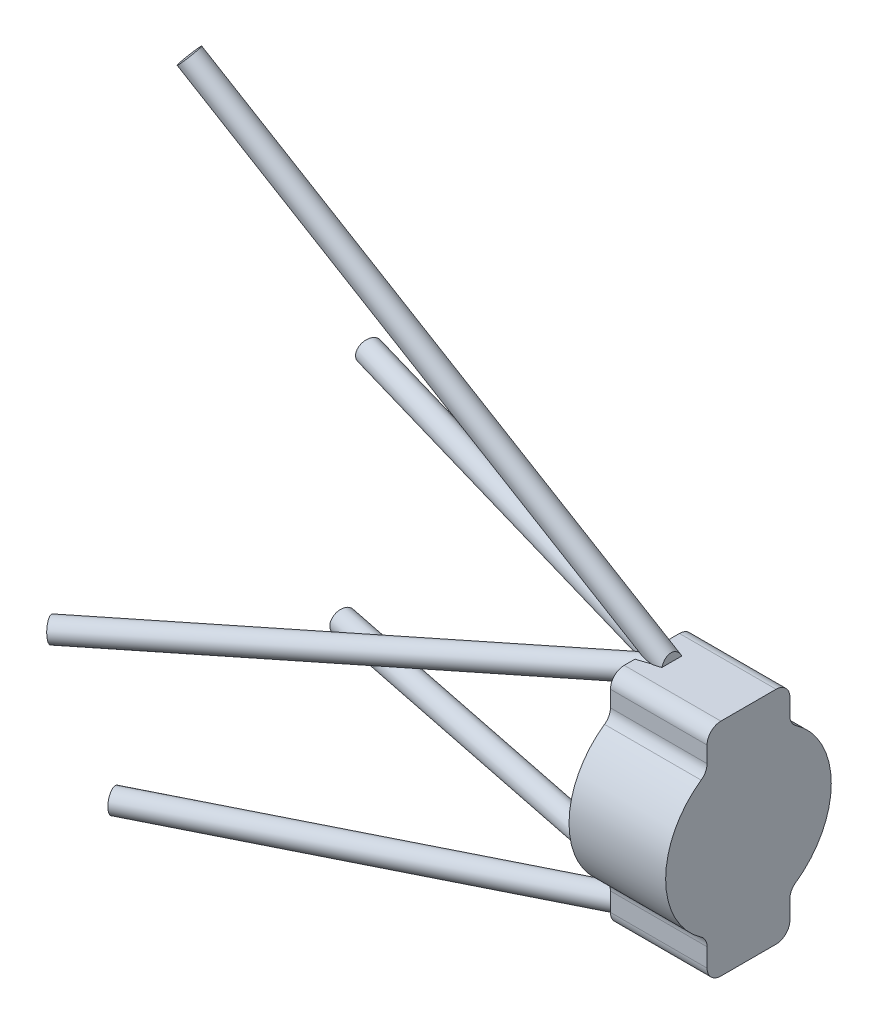
ISO-10303-21;
HEADER;
FILE_DESCRIPTION(('STEP AP214'),'2;1');
FILE_NAME('part.step','',(''),(''),'','','');
FILE_SCHEMA(('AUTOMOTIVE_DESIGN { 1 0 10303 214 1 1 1 1 }'));
ENDSEC;
DATA;
#1=APPLICATION_CONTEXT('core data for automotive mechanical design processes');
#2=APPLICATION_PROTOCOL_DEFINITION('international standard','automotive_design',2000,#1);
#3=PRODUCT_CONTEXT('',#1,'mechanical');
#4=PRODUCT('Part','Part','',(#3));
#5=PRODUCT_RELATED_PRODUCT_CATEGORY('part','',(#4));
#6=PRODUCT_DEFINITION_FORMATION('','',#4);
#7=PRODUCT_DEFINITION_CONTEXT('part definition',#1,'design');
#8=PRODUCT_DEFINITION('design','',#6,#7);
#9=PRODUCT_DEFINITION_SHAPE('','',#8);
#10=(LENGTH_UNIT() NAMED_UNIT(*) SI_UNIT(.MILLI.,.METRE.));
#11=(NAMED_UNIT(*) PLANE_ANGLE_UNIT() SI_UNIT($,.RADIAN.));
#12=(NAMED_UNIT(*) SI_UNIT($,.STERADIAN.) SOLID_ANGLE_UNIT());
#13=UNCERTAINTY_MEASURE_WITH_UNIT(LENGTH_MEASURE(1.E-05),#10,'distance_accuracy_value','');
#14=(GEOMETRIC_REPRESENTATION_CONTEXT(3) GLOBAL_UNCERTAINTY_ASSIGNED_CONTEXT((#13)) GLOBAL_UNIT_ASSIGNED_CONTEXT((#10,
#11,#12)) REPRESENTATION_CONTEXT('',''));
#15=CARTESIAN_POINT('',(0.,0.,0.));
#16=DIRECTION('',(0.,0.,1.));
#17=DIRECTION('',(1.,0.,0.));
#18=AXIS2_PLACEMENT_3D('',#15,#16,#17);
#19=CARTESIAN_POINT('',(535.,121.,0.));
#20=DIRECTION('',(0.,1.,0.));
#21=DIRECTION('',(0.,0.,-1.));
#22=AXIS2_PLACEMENT_3D('',#19,#20,#21);
#23=PLANE('',#22);
#24=CARTESIAN_POINT('',(625.,121.,615.470743605705));
#25=DIRECTION('',(0.,-1.,0.));
#26=DIRECTION('',(-0.984919836826868,0.,-0.173011314730962));
#27=AXIS2_PLACEMENT_3D('',#24,#25,#26);
#28=ELLIPSE('',#27,235.687976944856,8.00000000000003);
#29=CARTESIAN_POINT('',(480.,121.,583.687334384309));
#30=VERTEX_POINT('',#29);
#31=CARTESIAN_POINT('',(465.,121.,581.513610561944));
#32=VERTEX_POINT('',#31);
#33=EDGE_CURVE('E198',#30,#32,#28,.F.);
#34=ORIENTED_EDGE('',*,*,#33,.T.);
#35=DIRECTION('',(0.,0.,1.));
#36=VECTOR('',#35,1.);
#37=CARTESIAN_POINT('',(465.,121.,0.));
#38=LINE('',#37,#36);
#39=CARTESIAN_POINT('',(465.,121.,570.));
#40=VERTEX_POINT('',#39);
#41=EDGE_CURVE('E249',#40,#32,#38,.T.);
#42=ORIENTED_EDGE('',*,*,#41,.F.);
#43=DIRECTION('',(-1.,0.,0.));
#44=VECTOR('',#43,1.);
#45=CARTESIAN_POINT('',(535.,121.,570.));
#46=LINE('',#45,#44);
#47=CARTESIAN_POINT('',(535.,121.,570.));
#48=VERTEX_POINT('',#47);
#49=EDGE_CURVE('E295',#48,#40,#46,.T.);
#50=ORIENTED_EDGE('',*,*,#49,.F.);
#51=DIRECTION('',(0.,0.,1.));
#52=VECTOR('',#51,1.);
#53=CARTESIAN_POINT('',(535.,121.,0.));
#54=LINE('',#53,#52);
#55=CARTESIAN_POINT('',(535.,121.,610.));
#56=VERTEX_POINT('',#55);
#57=EDGE_CURVE('E226',#48,#56,#54,.T.);
#58=ORIENTED_EDGE('',*,*,#57,.T.);
#59=DIRECTION('',(-1.,0.,0.));
#60=VECTOR('',#59,1.);
#61=CARTESIAN_POINT('',(535.,121.,610.));
#62=LINE('',#61,#60);
#63=CARTESIAN_POINT('',(465.,121.,610.));
#64=VERTEX_POINT('',#63);
#65=EDGE_CURVE('E292',#64,#56,#62,.F.);
#66=ORIENTED_EDGE('',*,*,#65,.F.);
#67=CARTESIAN_POINT('',(465.,121.,603.506205639318));
#68=VERTEX_POINT('',#67);
#69=EDGE_CURVE('E248',#68,#64,#38,.T.);
#70=ORIENTED_EDGE('',*,*,#69,.F.);
#71=CARTESIAN_POINT('',(407.5,121.,618.637222806044));
#72=DIRECTION('',(0.,-1.,0.));
#73=DIRECTION('',(0.930072822847603,0.,-0.367375209017009));
#74=AXIS2_PLACEMENT_3D('',#71,#72,#73);
#75=ELLIPSE('',#74,124.977725042946,8.00000000000003);
#76=CARTESIAN_POINT('',(480.,121.,596.858117852031));
#77=VERTEX_POINT('',#76);
#78=EDGE_CURVE('E203',#68,#77,#75,.F.);
#79=ORIENTED_EDGE('',*,*,#78,.T.);
#80=DIRECTION('',(0.,0.,1.));
#81=VECTOR('',#80,1.);
#82=CARTESIAN_POINT('',(480.,121.,0.));
#83=LINE('',#82,#81);
#84=EDGE_CURVE('E11',#30,#77,#83,.T.);
#85=ORIENTED_EDGE('',*,*,#84,.F.);
#86=EDGE_LOOP('',(#34,#42,#50,#58,#66,#70,#79,#85));
#87=FACE_BOUND('',#86,.T.);
#88=ADVANCED_FACE('F35',(#87),#23,.F.);
#89=CARTESIAN_POINT('',(511.116094164574,273.854062471409,597.51078135007));
#90=DIRECTION('',(-0.969905090031444,0.0668900062090649,-0.234115021731727));
#91=DIRECTION('',(0.234640533103896,0.,-0.972082208573287));
#92=AXIS2_PLACEMENT_3D('',#89,#90,#91);
#93=CYLINDRICAL_SURFACE('',#92,8.);
#94=CARTESIAN_POINT('',(190.,296.,520.));
#95=DIRECTION('',(-0.969905090031444,0.0668900062090645,-0.234115021731728));
#96=DIRECTION('',(-0.234640533103897,0.,0.972082208573287));
#97=AXIS2_PLACEMENT_3D('',#94,#95,#96);
#98=CIRCLE('',#97,8.);
#99=CARTESIAN_POINT('',(188.122875735169,296.,527.776657668586));
#100=VERTEX_POINT('',#99);
#101=EDGE_CURVE('E272',#100,#100,#98,.T.);
#102=ORIENTED_EDGE('',*,*,#101,.F.);
#103=EDGE_LOOP('',(#102));
#104=FACE_BOUND('',#103,.T.);
#105=CARTESIAN_POINT('',(465.,277.034482758621,586.379310344828));
#106=DIRECTION('',(-1.,0.,0.));
#107=DIRECTION('',(0.,0.274721127897378,-0.961523947640823));
#108=AXIS2_PLACEMENT_3D('',#105,#106,#107);
#109=ELLIPSE('',#108,8.2482297311592,8.);
#110=CARTESIAN_POINT('',(465.,281.,579.161491685434));
#111=VERTEX_POINT('',#110);
#112=CARTESIAN_POINT('',(465.,270.063206504348,590.561479475967));
#113=VERTEX_POINT('',#112);
#114=EDGE_CURVE('E263',#111,#113,#109,.T.);
#115=ORIENTED_EDGE('',*,*,#114,.T.);
#116=CARTESIAN_POINT('',(480.,276.,590.));
#117=DIRECTION('',(0.135168588119068,-0.250864202622691,0.958538786188842));
#118=DIRECTION('',(0.990805622413367,0.0285568196526257,-0.132244949413534));
#119=AXIS2_PLACEMENT_3D('',#116,#117,#118);
#120=ELLIPSE('',#119,21.4886626436982,8.);
#121=CARTESIAN_POINT('',(463.606851072773,280.453087507761,593.477124859406));
#122=VERTEX_POINT('',#121);
#123=EDGE_CURVE('E276',#122,#113,#120,.T.);
#124=ORIENTED_EDGE('',*,*,#123,.F.);
#125=CARTESIAN_POINT('',(480.,276.,590.));
#126=DIRECTION('',(0.324409978096139,0.799427422100928,0.505642129281894));
#127=DIRECTION('',(-0.915263402952188,0.400265612961647,-0.0456107695266876));
#128=AXIS2_PLACEMENT_3D('',#125,#126,#127);
#129=ELLIPSE('',#128,21.0775029286955,7.99999999999998);
#130=CARTESIAN_POINT('',(478.518147982287,281.,583.045655560998));
#131=VERTEX_POINT('',#130);
#132=EDGE_CURVE('E269',#131,#122,#129,.T.);
#133=ORIENTED_EDGE('',*,*,#132,.F.);
#134=CARTESIAN_POINT('',(407.500000000001,281.,572.5));
#135=DIRECTION('',(0.,-1.,0.));
#136=DIRECTION('',(-0.972082208573287,0.,-0.234640533103896));
#137=AXIS2_PLACEMENT_3D('',#134,#135,#136);
#138=ELLIPSE('',#137,119.599331101809,8.);
#139=EDGE_CURVE('E260',#111,#131,#138,.T.);
#140=ORIENTED_EDGE('',*,*,#139,.F.);
#141=EDGE_LOOP('',(#115,#124,#133,#140));
#142=FACE_BOUND('',#141,.T.);
#143=ADVANCED_FACE('F423',(#104,#142),#93,.T.);
#144=CARTESIAN_POINT('',(190.,236.,750.));
#145=DIRECTION('',(0.869261441528762,0.119898129866036,-0.479592519464145));
#146=DIRECTION('',(0.483077342911335,0.,0.875577684026794));
#147=AXIS2_PLACEMENT_3D('',#144,#145,#146);
#148=CYLINDRICAL_SURFACE('',#147,8.);
#149=CARTESIAN_POINT('',(190.,236.,750.));
#150=DIRECTION('',(0.869261441528762,0.119898129866035,-0.479592519464144));
#151=DIRECTION('',(-0.477960879872597,0.451586908048764,-0.753407367756892));
#152=AXIS2_PLACEMENT_3D('',#149,#150,#151);
#153=CIRCLE('',#152,8.);
#154=CARTESIAN_POINT('',(186.176312961019,239.61269526439,743.972741057945));
#155=VERTEX_POINT('',#154);
#156=EDGE_CURVE('E273',#155,#155,#153,.T.);
#157=ORIENTED_EDGE('',*,*,#156,.T.);
#158=EDGE_LOOP('',(#157));
#159=FACE_BOUND('',#158,.T.);
#160=CARTESIAN_POINT('',(480.,276.,590.));
#161=DIRECTION('',(-0.167047494013726,-0.91043565751986,0.378420464906584));
#162=DIRECTION('',(0.884931142325889,-0.307683013819203,-0.349611264619618));
#163=AXIS2_PLACEMENT_3D('',#160,#161,#162);
#164=ELLIPSE('',#163,18.3547237538498,7.99999999999998);
#165=CARTESIAN_POINT('',(473.763170810238,281.,599.276273157491));
#166=VERTEX_POINT('',#165);
#167=EDGE_CURVE('E279',#122,#166,#164,.F.);
#168=ORIENTED_EDGE('',*,*,#167,.F.);
#169=ORIENTED_EDGE('',*,*,#123,.T.);
#170=CARTESIAN_POINT('',(465.,273.931034482759,598.275862068966));
#171=DIRECTION('',(-1.,0.,0.));
#172=DIRECTION('',(0.,0.242535625036333,-0.970142500145332));
#173=AXIS2_PLACEMENT_3D('',#170,#171,#172);
#174=ELLIPSE('',#173,9.20321507178608,8.);
#175=CARTESIAN_POINT('',(465.,281.,602.156160948246));
#176=VERTEX_POINT('',#175);
#177=EDGE_CURVE('E289',#113,#176,#174,.T.);
#178=ORIENTED_EDGE('',*,*,#177,.T.);
#179=CARTESIAN_POINT('',(516.25,281.,570.));
#180=DIRECTION('',(0.,-1.,0.));
#181=DIRECTION('',(0.875577684026794,0.,-0.483077342911335));
#182=AXIS2_PLACEMENT_3D('',#179,#180,#181);
#183=ELLIPSE('',#182,66.7233092704491,8.);
#184=EDGE_CURVE('E257',#166,#176,#183,.T.);
#185=ORIENTED_EDGE('',*,*,#184,.F.);
#186=EDGE_LOOP('',(#168,#169,#178,#185));
#187=FACE_BOUND('',#186,.T.);
#188=ADVANCED_FACE('F416',(#159,#187),#148,.T.);
#189=CARTESIAN_POINT('',(480.,276.,590.));
#190=DIRECTION('',(-0.723644436333627,0.673737923483032,0.149719538551785));
#191=DIRECTION('',(-0.681418527918843,-0.73189397443135,0.));
#192=AXIS2_PLACEMENT_3D('',#189,#190,#191);
#193=CYLINDRICAL_SURFACE('',#192,7.99999999999995);
#194=CARTESIAN_POINT('',(474.629629629629,281.,591.111111111111));
#195=DIRECTION('',(0.,-1.,0.));
#196=DIRECTION('',(-0.979260419507103,0.,0.202605604035952));
#197=AXIS2_PLACEMENT_3D('',#194,#195,#196);
#198=ELLIPSE('',#197,11.8740532797119,7.99999999999995);
#199=CARTESIAN_POINT('',(480.,281.,597.710972204488));
#200=VERTEX_POINT('',#199);
#201=EDGE_CURVE('E256',#166,#200,#198,.F.);
#202=ORIENTED_EDGE('',*,*,#201,.T.);
#203=CARTESIAN_POINT('',(480.,276.,590.));
#204=DIRECTION('',(-1.,0.,0.));
#205=DIRECTION('',(0.,0.976187060183953,0.216930457818656));
#206=AXIS2_PLACEMENT_3D('',#203,#204,#205);
#207=ELLIPSE('',#206,11.0551530535248,7.99999999999995);
#208=CARTESIAN_POINT('',(480.,281.,583.32087492927));
#209=VERTEX_POINT('',#208);
#210=EDGE_CURVE('E284',#209,#200,#207,.F.);
#211=ORIENTED_EDGE('',*,*,#210,.F.);
#212=EDGE_CURVE('E232',#209,#131,#198,.F.);
#213=ORIENTED_EDGE('',*,*,#212,.T.);
#214=ORIENTED_EDGE('',*,*,#132,.T.);
#215=ORIENTED_EDGE('',*,*,#167,.T.);
#216=EDGE_LOOP('',(#202,#211,#213,#214,#215));
#217=FACE_BOUND('',#216,.T.);
#218=CARTESIAN_POINT('',(190.,546.,650.));
#219=DIRECTION('',(0.723644436333627,-0.673737923483032,-0.149719538551785));
#220=DIRECTION('',(-0.681418527918843,-0.73189397443135,0.));
#221=AXIS2_PLACEMENT_3D('',#218,#219,#220);
#222=CIRCLE('',#221,7.99999999999995);
#223=CARTESIAN_POINT('',(184.548651776649,540.144848204549,650.));
#224=VERTEX_POINT('',#223);
#225=EDGE_CURVE('E266',#224,#224,#222,.T.);
#226=ORIENTED_EDGE('',*,*,#225,.T.);
#227=EDGE_LOOP('',(#226));
#228=FACE_BOUND('',#227,.T.);
#229=ADVANCED_FACE('F487',(#217,#228),#193,.T.);
#230=CARTESIAN_POINT('',(190.,296.,520.));
#231=DIRECTION('',(0.969905090031444,-0.0668900062090645,0.234115021731728));
#232=DIRECTION('',(-0.234640533103897,0.,0.972082208573287));
#233=AXIS2_PLACEMENT_3D('',#230,#231,#232);
#234=PLANE('',#233);
#235=ORIENTED_EDGE('',*,*,#101,.T.);
#236=EDGE_LOOP('',(#235));
#237=FACE_BOUND('',#236,.T.);
#238=ADVANCED_FACE('F490',(#237),#234,.F.);
#239=CARTESIAN_POINT('',(190.,236.,750.));
#240=DIRECTION('',(-0.869261441528762,-0.119898129866035,0.479592519464144));
#241=DIRECTION('',(-0.477960879872597,0.451586908048764,-0.753407367756892));
#242=AXIS2_PLACEMENT_3D('',#239,#240,#241);
#243=PLANE('',#242);
#244=ORIENTED_EDGE('',*,*,#156,.F.);
#245=EDGE_LOOP('',(#244));
#246=FACE_BOUND('',#245,.T.);
#247=ADVANCED_FACE('F494',(#246),#243,.T.);
#248=CARTESIAN_POINT('',(190.,546.,650.));
#249=DIRECTION('',(-0.723644436333627,0.673737923483032,0.149719538551785));
#250=DIRECTION('',(-0.681418527918843,-0.73189397443135,0.));
#251=AXIS2_PLACEMENT_3D('',#248,#249,#250);
#252=PLANE('',#251);
#253=ORIENTED_EDGE('',*,*,#225,.F.);
#254=EDGE_LOOP('',(#253));
#255=FACE_BOUND('',#254,.T.);
#256=ADVANCED_FACE('F485',(#255),#252,.T.);
#257=CARTESIAN_POINT('',(480.,346.,619.094765483027));
#258=DIRECTION('',(1.,0.,0.));
#259=DIRECTION('',(0.,0.,1.));
#260=AXIS2_PLACEMENT_3D('',#257,#258,#259);
#261=PLANE('',#260);
#262=DIRECTION('',(0.,0.,-1.));
#263=VECTOR('',#262,1.);
#264=CARTESIAN_POINT('',(480.,281.,619.094765483027));
#265=LINE('',#264,#263);
#266=EDGE_CURVE('E287',#200,#209,#265,.T.);
#267=ORIENTED_EDGE('',*,*,#266,.T.);
#268=ORIENTED_EDGE('',*,*,#210,.T.);
#269=EDGE_LOOP('',(#267,#268));
#270=FACE_BOUND('',#269,.T.);
#271=ADVANCED_FACE('F480',(#270),#261,.T.);
#272=CARTESIAN_POINT('',(535.,281.,0.));
#273=DIRECTION('',(0.,1.,0.));
#274=DIRECTION('',(0.,0.,-1.));
#275=AXIS2_PLACEMENT_3D('',#272,#273,#274);
#276=PLANE('',#275);
#277=DIRECTION('',(0.,0.,1.));
#278=VECTOR('',#277,1.);
#279=CARTESIAN_POINT('',(535.,281.,0.));
#280=LINE('',#279,#278);
#281=CARTESIAN_POINT('',(535.,281.,570.));
#282=VERTEX_POINT('',#281);
#283=CARTESIAN_POINT('',(535.,281.,610.));
#284=VERTEX_POINT('',#283);
#285=EDGE_CURVE('E219',#282,#284,#280,.T.);
#286=ORIENTED_EDGE('',*,*,#285,.F.);
#287=DIRECTION('',(-1.,0.,0.));
#288=VECTOR('',#287,1.);
#289=CARTESIAN_POINT('',(535.,281.,570.));
#290=LINE('',#289,#288);
#291=CARTESIAN_POINT('',(465.,281.,570.));
#292=VERTEX_POINT('',#291);
#293=EDGE_CURVE('E350',#292,#282,#290,.F.);
#294=ORIENTED_EDGE('',*,*,#293,.F.);
#295=DIRECTION('',(0.,0.,1.));
#296=VECTOR('',#295,1.);
#297=CARTESIAN_POINT('',(465.,281.,0.));
#298=LINE('',#297,#296);
#299=EDGE_CURVE('E242',#292,#111,#298,.T.);
#300=ORIENTED_EDGE('',*,*,#299,.T.);
#301=ORIENTED_EDGE('',*,*,#139,.T.);
#302=ORIENTED_EDGE('',*,*,#212,.F.);
#303=ORIENTED_EDGE('',*,*,#266,.F.);
#304=ORIENTED_EDGE('',*,*,#201,.F.);
#305=ORIENTED_EDGE('',*,*,#184,.T.);
#306=CARTESIAN_POINT('',(465.,281.,610.));
#307=VERTEX_POINT('',#306);
#308=EDGE_CURVE('E241',#176,#307,#298,.T.);
#309=ORIENTED_EDGE('',*,*,#308,.T.);
#310=DIRECTION('',(-1.,0.,0.));
#311=VECTOR('',#310,1.);
#312=CARTESIAN_POINT('',(465.,281.,610.));
#313=LINE('',#312,#311);
#314=EDGE_CURVE('E353',#284,#307,#313,.T.);
#315=ORIENTED_EDGE('',*,*,#314,.F.);
#316=EDGE_LOOP('',(#286,#294,#300,#301,#302,#303,#304,#305,#309,#315));
#317=FACE_BOUND('',#316,.T.);
#318=ADVANCED_FACE('F412',(#317),#276,.T.);
#319=CARTESIAN_POINT('',(535.,201.874728277563,590.));
#320=DIRECTION('',(-1.,0.,0.));
#321=DIRECTION('',(0.,0.,-1.));
#322=AXIS2_PLACEMENT_3D('',#319,#320,#321);
#323=CYLINDRICAL_SURFACE('',#322,60.0000000000001);
#324=CARTESIAN_POINT('',(535.,201.874728277563,590.));
#325=DIRECTION('',(-1.,0.,0.));
#326=DIRECTION('',(0.,0.,1.));
#327=AXIS2_PLACEMENT_3D('',#324,#325,#326);
#328=CIRCLE('',#327,60.0000000000001);
#329=CARTESIAN_POINT('',(535.,152.635619878666,624.285714285714));
#330=VERTEX_POINT('',#329);
#331=CARTESIAN_POINT('',(535.,251.113836676461,624.285714285714));
#332=VERTEX_POINT('',#331);
#333=EDGE_CURVE('E215',#330,#332,#328,.T.);
#334=ORIENTED_EDGE('',*,*,#333,.T.);
#335=DIRECTION('',(-1.,0.,0.));
#336=VECTOR('',#335,1.);
#337=CARTESIAN_POINT('',(535.,251.113836676461,624.285714285714));
#338=LINE('',#337,#336);
#339=CARTESIAN_POINT('',(465.,251.113836676461,624.285714285714));
#340=VERTEX_POINT('',#339);
#341=EDGE_CURVE('E326',#340,#332,#338,.F.);
#342=ORIENTED_EDGE('',*,*,#341,.F.);
#343=CARTESIAN_POINT('',(465.,201.874728277563,590.));
#344=DIRECTION('',(-1.,0.,0.));
#345=DIRECTION('',(0.,0.,1.));
#346=AXIS2_PLACEMENT_3D('',#343,#344,#345);
#347=CIRCLE('',#346,60.0000000000001);
#348=CARTESIAN_POINT('',(465.,152.635619878666,624.285714285714));
#349=VERTEX_POINT('',#348);
#350=EDGE_CURVE('E209',#349,#340,#347,.T.);
#351=ORIENTED_EDGE('',*,*,#350,.F.);
#352=DIRECTION('',(-1.,0.,0.));
#353=VECTOR('',#352,1.);
#354=CARTESIAN_POINT('',(535.,152.635619878666,624.285714285714));
#355=LINE('',#354,#353);
#356=EDGE_CURVE('E329',#330,#349,#355,.T.);
#357=ORIENTED_EDGE('',*,*,#356,.F.);
#358=EDGE_LOOP('',(#334,#342,#351,#357));
#359=FACE_BOUND('',#358,.T.);
#360=ADVANCED_FACE('F396',(#359),#323,.T.);
#361=CARTESIAN_POINT('',(535.,46.,620.));
#362=DIRECTION('',(0.,0.,-1.));
#363=DIRECTION('',(1.,0.,0.));
#364=AXIS2_PLACEMENT_3D('',#361,#362,#363);
#365=PLANE('',#364);
#366=DIRECTION('',(0.,1.,0.));
#367=VECTOR('',#366,1.);
#368=CARTESIAN_POINT('',(535.,46.,620.));
#369=LINE('',#368,#367);
#370=CARTESIAN_POINT('',(535.,259.320354742944,620.));
#371=VERTEX_POINT('',#370);
#372=CARTESIAN_POINT('',(535.,271.,620.));
#373=VERTEX_POINT('',#372);
#374=EDGE_CURVE('E216',#371,#373,#369,.T.);
#375=ORIENTED_EDGE('',*,*,#374,.T.);
#376=DIRECTION('',(-1.,0.,0.));
#377=VECTOR('',#376,1.);
#378=CARTESIAN_POINT('',(535.,271.,620.));
#379=LINE('',#378,#377);
#380=CARTESIAN_POINT('',(465.,271.,620.));
#381=VERTEX_POINT('',#380);
#382=EDGE_CURVE('E338',#381,#373,#379,.F.);
#383=ORIENTED_EDGE('',*,*,#382,.F.);
#384=DIRECTION('',(0.,1.,0.));
#385=VECTOR('',#384,1.);
#386=CARTESIAN_POINT('',(465.,46.,620.));
#387=LINE('',#386,#385);
#388=CARTESIAN_POINT('',(465.,259.320354742944,620.));
#389=VERTEX_POINT('',#388);
#390=EDGE_CURVE('E238',#389,#381,#387,.T.);
#391=ORIENTED_EDGE('',*,*,#390,.F.);
#392=DIRECTION('',(1.,0.,0.));
#393=VECTOR('',#392,1.);
#394=CARTESIAN_POINT('',(465.,259.320354742944,620.));
#395=LINE('',#394,#393);
#396=EDGE_CURVE('E341',#371,#389,#395,.F.);
#397=ORIENTED_EDGE('',*,*,#396,.F.);
#398=EDGE_LOOP('',(#375,#383,#391,#397));
#399=FACE_BOUND('',#398,.T.);
#400=ADVANCED_FACE('F405',(#399),#365,.F.);
#401=CARTESIAN_POINT('',(535.,46.,560.));
#402=DIRECTION('',(0.,0.,-1.));
#403=DIRECTION('',(1.,0.,0.));
#404=AXIS2_PLACEMENT_3D('',#401,#402,#403);
#405=PLANE('',#404);
#406=DIRECTION('',(0.,1.,0.));
#407=VECTOR('',#406,1.);
#408=CARTESIAN_POINT('',(465.,46.,560.));
#409=LINE('',#408,#407);
#410=CARTESIAN_POINT('',(465.,259.320354742944,560.));
#411=VERTEX_POINT('',#410);
#412=CARTESIAN_POINT('',(465.,271.,560.));
#413=VERTEX_POINT('',#412);
#414=EDGE_CURVE('E237',#411,#413,#409,.T.);
#415=ORIENTED_EDGE('',*,*,#414,.T.);
#416=DIRECTION('',(-1.,0.,0.));
#417=VECTOR('',#416,1.);
#418=CARTESIAN_POINT('',(535.,271.,560.));
#419=LINE('',#418,#417);
#420=CARTESIAN_POINT('',(535.,271.,560.));
#421=VERTEX_POINT('',#420);
#422=EDGE_CURVE('E344',#421,#413,#419,.T.);
#423=ORIENTED_EDGE('',*,*,#422,.F.);
#424=DIRECTION('',(0.,1.,0.));
#425=VECTOR('',#424,1.);
#426=CARTESIAN_POINT('',(535.,46.,560.));
#427=LINE('',#426,#425);
#428=CARTESIAN_POINT('',(535.,259.320354742944,560.));
#429=VERTEX_POINT('',#428);
#430=EDGE_CURVE('E214',#429,#421,#427,.T.);
#431=ORIENTED_EDGE('',*,*,#430,.F.);
#432=DIRECTION('',(-1.,0.,0.));
#433=VECTOR('',#432,1.);
#434=CARTESIAN_POINT('',(535.,259.320354742944,560.));
#435=LINE('',#434,#433);
#436=EDGE_CURVE('E347',#411,#429,#435,.F.);
#437=ORIENTED_EDGE('',*,*,#436,.F.);
#438=EDGE_LOOP('',(#415,#423,#431,#437));
#439=FACE_BOUND('',#438,.T.);
#440=ADVANCED_FACE('F432',(#439),#405,.T.);
#441=CARTESIAN_POINT('',(465.,251.113836676461,555.714285714286));
#442=VERTEX_POINT('',#441);
#443=CARTESIAN_POINT('',(465.,152.635619878666,555.714285714286));
#444=VERTEX_POINT('',#443);
#445=EDGE_CURVE('E233',#442,#444,#347,.T.);
#446=ORIENTED_EDGE('',*,*,#445,.F.);
#447=DIRECTION('',(-1.,0.,0.));
#448=VECTOR('',#447,1.);
#449=CARTESIAN_POINT('',(535.,251.113836676461,555.714285714286));
#450=LINE('',#449,#448);
#451=CARTESIAN_POINT('',(535.,251.113836676461,555.714285714286));
#452=VERTEX_POINT('',#451);
#453=EDGE_CURVE('E332',#452,#442,#450,.T.);
#454=ORIENTED_EDGE('',*,*,#453,.F.);
#455=CARTESIAN_POINT('',(535.,152.635619878666,555.714285714286));
#456=VERTEX_POINT('',#455);
#457=EDGE_CURVE('E210',#452,#456,#328,.T.);
#458=ORIENTED_EDGE('',*,*,#457,.T.);
#459=DIRECTION('',(-1.,0.,0.));
#460=VECTOR('',#459,1.);
#461=CARTESIAN_POINT('',(535.,152.635619878666,555.714285714286));
#462=LINE('',#461,#460);
#463=EDGE_CURVE('E335',#444,#456,#462,.F.);
#464=ORIENTED_EDGE('',*,*,#463,.F.);
#465=EDGE_LOOP('',(#446,#454,#458,#464));
#466=FACE_BOUND('',#465,.T.);
#467=ADVANCED_FACE('F441',(#466),#323,.T.);
#468=CARTESIAN_POINT('',(535.,46.,560.));
#469=DIRECTION('',(0.,0.,1.));
#470=DIRECTION('',(-1.,0.,0.));
#471=AXIS2_PLACEMENT_3D('',#468,#469,#470);
#472=PLANE('',#471);
#473=DIRECTION('',(0.,-1.,0.));
#474=VECTOR('',#473,1.);
#475=CARTESIAN_POINT('',(465.,46.,560.));
#476=LINE('',#475,#474);
#477=CARTESIAN_POINT('',(465.,144.429101812183,560.));
#478=VERTEX_POINT('',#477);
#479=CARTESIAN_POINT('',(465.,131.,560.));
#480=VERTEX_POINT('',#479);
#481=EDGE_CURVE('E236',#478,#480,#476,.T.);
#482=ORIENTED_EDGE('',*,*,#481,.F.);
#483=DIRECTION('',(1.,0.,0.));
#484=VECTOR('',#483,1.);
#485=CARTESIAN_POINT('',(465.,144.429101812183,560.));
#486=LINE('',#485,#484);
#487=CARTESIAN_POINT('',(535.,144.429101812183,560.));
#488=VERTEX_POINT('',#487);
#489=EDGE_CURVE('E306',#488,#478,#486,.F.);
#490=ORIENTED_EDGE('',*,*,#489,.F.);
#491=DIRECTION('',(0.,-1.,0.));
#492=VECTOR('',#491,1.);
#493=CARTESIAN_POINT('',(535.,46.,560.));
#494=LINE('',#493,#492);
#495=CARTESIAN_POINT('',(535.,131.,560.));
#496=VERTEX_POINT('',#495);
#497=EDGE_CURVE('E213',#488,#496,#494,.T.);
#498=ORIENTED_EDGE('',*,*,#497,.T.);
#499=DIRECTION('',(-1.,0.,0.));
#500=VECTOR('',#499,1.);
#501=CARTESIAN_POINT('',(535.,131.,560.));
#502=LINE('',#501,#500);
#503=EDGE_CURVE('E309',#480,#496,#502,.F.);
#504=ORIENTED_EDGE('',*,*,#503,.F.);
#505=EDGE_LOOP('',(#482,#490,#498,#504));
#506=FACE_BOUND('',#505,.T.);
#507=ADVANCED_FACE('F449',(#506),#472,.F.);
#508=CARTESIAN_POINT('',(535.,46.,620.));
#509=DIRECTION('',(0.,0.,1.));
#510=DIRECTION('',(-1.,0.,0.));
#511=AXIS2_PLACEMENT_3D('',#508,#509,#510);
#512=PLANE('',#511);
#513=DIRECTION('',(0.,-1.,0.));
#514=VECTOR('',#513,1.);
#515=CARTESIAN_POINT('',(535.,46.,620.));
#516=LINE('',#515,#514);
#517=CARTESIAN_POINT('',(535.,144.429101812183,620.));
#518=VERTEX_POINT('',#517);
#519=CARTESIAN_POINT('',(535.,131.,620.));
#520=VERTEX_POINT('',#519);
#521=EDGE_CURVE('E229',#518,#520,#516,.T.);
#522=ORIENTED_EDGE('',*,*,#521,.F.);
#523=DIRECTION('',(-1.,0.,0.));
#524=VECTOR('',#523,1.);
#525=CARTESIAN_POINT('',(535.,144.429101812183,620.));
#526=LINE('',#525,#524);
#527=CARTESIAN_POINT('',(465.,144.429101812183,620.));
#528=VERTEX_POINT('',#527);
#529=EDGE_CURVE('E320',#528,#518,#526,.F.);
#530=ORIENTED_EDGE('',*,*,#529,.F.);
#531=DIRECTION('',(0.,-1.,0.));
#532=VECTOR('',#531,1.);
#533=CARTESIAN_POINT('',(465.,46.,620.));
#534=LINE('',#533,#532);
#535=CARTESIAN_POINT('',(465.,131.,620.));
#536=VERTEX_POINT('',#535);
#537=EDGE_CURVE('E252',#528,#536,#534,.T.);
#538=ORIENTED_EDGE('',*,*,#537,.T.);
#539=DIRECTION('',(-1.,0.,0.));
#540=VECTOR('',#539,1.);
#541=CARTESIAN_POINT('',(465.,131.,620.));
#542=LINE('',#541,#540);
#543=EDGE_CURVE('E323',#520,#536,#542,.T.);
#544=ORIENTED_EDGE('',*,*,#543,.F.);
#545=EDGE_LOOP('',(#522,#530,#538,#544));
#546=FACE_BOUND('',#545,.T.);
#547=ADVANCED_FACE('F387',(#546),#512,.T.);
#548=CARTESIAN_POINT('',(535.,46.,0.));
#549=DIRECTION('',(1.,0.,0.));
#550=DIRECTION('',(0.,0.,1.));
#551=AXIS2_PLACEMENT_3D('',#548,#549,#550);
#552=PLANE('',#551);
#553=ORIENTED_EDGE('',*,*,#497,.F.);
#554=CARTESIAN_POINT('',(535.,144.429101812183,550.));
#555=DIRECTION('',(-1.,0.,0.));
#556=DIRECTION('',(0.,0.,1.));
#557=AXIS2_PLACEMENT_3D('',#554,#555,#556);
#558=CIRCLE('',#557,10.);
#559=EDGE_CURVE('E362',#456,#488,#558,.F.);
#560=ORIENTED_EDGE('',*,*,#559,.F.);
#561=ORIENTED_EDGE('',*,*,#457,.F.);
#562=CARTESIAN_POINT('',(535.,259.320354742944,550.));
#563=DIRECTION('',(-1.,0.,0.));
#564=DIRECTION('',(0.,0.,1.));
#565=AXIS2_PLACEMENT_3D('',#562,#563,#564);
#566=CIRCLE('',#565,10.);
#567=EDGE_CURVE('E370',#429,#452,#566,.F.);
#568=ORIENTED_EDGE('',*,*,#567,.F.);
#569=ORIENTED_EDGE('',*,*,#430,.T.);
#570=CARTESIAN_POINT('',(535.,271.,570.));
#571=DIRECTION('',(-1.,0.,0.));
#572=DIRECTION('',(0.,0.,1.));
#573=AXIS2_PLACEMENT_3D('',#570,#571,#572);
#574=CIRCLE('',#573,10.);
#575=EDGE_CURVE('E312',#282,#421,#574,.T.);
#576=ORIENTED_EDGE('',*,*,#575,.F.);
#577=ORIENTED_EDGE('',*,*,#285,.T.);
#578=CARTESIAN_POINT('',(535.,271.,610.));
#579=DIRECTION('',(-1.,0.,0.));
#580=DIRECTION('',(0.,0.,1.));
#581=AXIS2_PLACEMENT_3D('',#578,#579,#580);
#582=CIRCLE('',#581,10.);
#583=EDGE_CURVE('E314',#373,#284,#582,.T.);
#584=ORIENTED_EDGE('',*,*,#583,.F.);
#585=ORIENTED_EDGE('',*,*,#374,.F.);
#586=CARTESIAN_POINT('',(535.,259.320354742944,630.));
#587=DIRECTION('',(-1.,0.,0.));
#588=DIRECTION('',(0.,0.,1.));
#589=AXIS2_PLACEMENT_3D('',#586,#587,#588);
#590=CIRCLE('',#589,10.);
#591=EDGE_CURVE('E366',#332,#371,#590,.F.);
#592=ORIENTED_EDGE('',*,*,#591,.F.);
#593=ORIENTED_EDGE('',*,*,#333,.F.);
#594=CARTESIAN_POINT('',(535.,144.429101812183,630.));
#595=DIRECTION('',(-1.,0.,0.));
#596=DIRECTION('',(0.,0.,1.));
#597=AXIS2_PLACEMENT_3D('',#594,#595,#596);
#598=CIRCLE('',#597,10.);
#599=EDGE_CURVE('E358',#518,#330,#598,.F.);
#600=ORIENTED_EDGE('',*,*,#599,.F.);
#601=ORIENTED_EDGE('',*,*,#521,.T.);
#602=CARTESIAN_POINT('',(535.,131.,610.));
#603=DIRECTION('',(-1.,0.,0.));
#604=DIRECTION('',(0.,0.,1.));
#605=AXIS2_PLACEMENT_3D('',#602,#603,#604);
#606=CIRCLE('',#605,10.);
#607=EDGE_CURVE('E316',#56,#520,#606,.T.);
#608=ORIENTED_EDGE('',*,*,#607,.F.);
#609=ORIENTED_EDGE('',*,*,#57,.F.);
#610=CARTESIAN_POINT('',(535.,131.,570.));
#611=DIRECTION('',(-1.,0.,0.));
#612=DIRECTION('',(0.,0.,1.));
#613=AXIS2_PLACEMENT_3D('',#610,#611,#612);
#614=CIRCLE('',#613,10.);
#615=EDGE_CURVE('E318',#496,#48,#614,.T.);
#616=ORIENTED_EDGE('',*,*,#615,.F.);
#617=EDGE_LOOP('',(#553,#560,#561,#568,#569,#576,#577,#584,#585,#592,#593,#600,#601,#608,#609,#616));
#618=FACE_BOUND('',#617,.T.);
#619=ADVANCED_FACE('F454',(#618),#552,.T.);
#620=CARTESIAN_POINT('',(465.,46.,0.));
#621=DIRECTION('',(1.,0.,0.));
#622=DIRECTION('',(0.,0.,1.));
#623=AXIS2_PLACEMENT_3D('',#620,#621,#622);
#624=PLANE('',#623);
#625=CARTESIAN_POINT('',(465.,126.51724137931,587.365095489065));
#626=DIRECTION('',(-1.,0.,0.));
#627=DIRECTION('',(0.,0.192627277046075,-0.981271997021119));
#628=AXIS2_PLACEMENT_3D('',#625,#626,#627);
#629=ELLIPSE('',#628,8.12717161878814,8.00000000000003);
#630=CARTESIAN_POINT('',(465.,132.48716105032,592.739868498816));
#631=VERTEX_POINT('',#630);
#632=EDGE_CURVE('E43',#32,#631,#629,.F.);
#633=ORIENTED_EDGE('',*,*,#632,.T.);
#634=CARTESIAN_POINT('',(465.,124.965517241379,595.924942649526));
#635=DIRECTION('',(-1.,0.,0.));
#636=DIRECTION('',(0.,0.171996015790114,-0.985097645186672));
#637=AXIS2_PLACEMENT_3D('',#634,#635,#636);
#638=ELLIPSE('',#637,8.61915345123766,8.00000000000003);
#639=EDGE_CURVE('E190',#631,#68,#638,.F.);
#640=ORIENTED_EDGE('',*,*,#639,.T.);
#641=ORIENTED_EDGE('',*,*,#69,.T.);
#642=CARTESIAN_POINT('',(465.,131.,610.));
#643=DIRECTION('',(-1.,0.,0.));
#644=DIRECTION('',(0.,0.,1.));
#645=AXIS2_PLACEMENT_3D('',#642,#643,#644);
#646=CIRCLE('',#645,10.);
#647=EDGE_CURVE('E302',#536,#64,#646,.F.);
#648=ORIENTED_EDGE('',*,*,#647,.F.);
#649=ORIENTED_EDGE('',*,*,#537,.F.);
#650=CARTESIAN_POINT('',(465.,144.429101812183,630.));
#651=DIRECTION('',(-1.,0.,0.));
#652=DIRECTION('',(0.,0.,1.));
#653=AXIS2_PLACEMENT_3D('',#650,#651,#652);
#654=CIRCLE('',#653,10.);
#655=EDGE_CURVE('E356',#349,#528,#654,.T.);
#656=ORIENTED_EDGE('',*,*,#655,.F.);
#657=ORIENTED_EDGE('',*,*,#350,.T.);
#658=CARTESIAN_POINT('',(465.,259.320354742944,630.));
#659=DIRECTION('',(-1.,0.,0.));
#660=DIRECTION('',(0.,0.,1.));
#661=AXIS2_PLACEMENT_3D('',#658,#659,#660);
#662=CIRCLE('',#661,10.);
#663=EDGE_CURVE('E364',#389,#340,#662,.T.);
#664=ORIENTED_EDGE('',*,*,#663,.F.);
#665=ORIENTED_EDGE('',*,*,#390,.T.);
#666=CARTESIAN_POINT('',(465.,271.,610.));
#667=DIRECTION('',(-1.,0.,0.));
#668=DIRECTION('',(0.,0.,1.));
#669=AXIS2_PLACEMENT_3D('',#666,#667,#668);
#670=CIRCLE('',#669,10.);
#671=EDGE_CURVE('E300',#307,#381,#670,.F.);
#672=ORIENTED_EDGE('',*,*,#671,.F.);
#673=ORIENTED_EDGE('',*,*,#308,.F.);
#674=ORIENTED_EDGE('',*,*,#177,.F.);
#675=ORIENTED_EDGE('',*,*,#114,.F.);
#676=ORIENTED_EDGE('',*,*,#299,.F.);
#677=CARTESIAN_POINT('',(465.,271.,570.));
#678=DIRECTION('',(-1.,0.,0.));
#679=DIRECTION('',(0.,0.,1.));
#680=AXIS2_PLACEMENT_3D('',#677,#678,#679);
#681=CIRCLE('',#680,10.);
#682=EDGE_CURVE('E298',#413,#292,#681,.F.);
#683=ORIENTED_EDGE('',*,*,#682,.F.);
#684=ORIENTED_EDGE('',*,*,#414,.F.);
#685=CARTESIAN_POINT('',(465.,259.320354742944,550.));
#686=DIRECTION('',(-1.,0.,0.));
#687=DIRECTION('',(0.,0.,1.));
#688=AXIS2_PLACEMENT_3D('',#685,#686,#687);
#689=CIRCLE('',#688,10.);
#690=EDGE_CURVE('E368',#442,#411,#689,.T.);
#691=ORIENTED_EDGE('',*,*,#690,.F.);
#692=ORIENTED_EDGE('',*,*,#445,.T.);
#693=CARTESIAN_POINT('',(465.,144.429101812183,550.));
#694=DIRECTION('',(-1.,0.,0.));
#695=DIRECTION('',(0.,0.,1.));
#696=AXIS2_PLACEMENT_3D('',#693,#694,#695);
#697=CIRCLE('',#696,10.);
#698=EDGE_CURVE('E360',#478,#444,#697,.T.);
#699=ORIENTED_EDGE('',*,*,#698,.F.);
#700=ORIENTED_EDGE('',*,*,#481,.T.);
#701=CARTESIAN_POINT('',(465.,131.,570.));
#702=DIRECTION('',(-1.,0.,0.));
#703=DIRECTION('',(0.,0.,1.));
#704=AXIS2_PLACEMENT_3D('',#701,#702,#703);
#705=CIRCLE('',#704,10.);
#706=EDGE_CURVE('E304',#40,#480,#705,.F.);
#707=ORIENTED_EDGE('',*,*,#706,.F.);
#708=ORIENTED_EDGE('',*,*,#41,.T.);
#709=EDGE_LOOP('',(#633,#640,#641,#648,#649,#656,#657,#664,#665,#672,#673,#674,#675,#676,#683,
#684,#691,#692,#699,#700,#707,#708));
#710=FACE_BOUND('',#709,.T.);
#711=ADVANCED_FACE('F373',(#710),#624,.F.);
#712=CARTESIAN_POINT('',(535.,131.,570.));
#713=DIRECTION('',(-1.,0.,0.));
#714=DIRECTION('',(0.,0.,-1.));
#715=AXIS2_PLACEMENT_3D('',#712,#713,#714);
#716=CYLINDRICAL_SURFACE('',#715,10.);
#717=ORIENTED_EDGE('',*,*,#615,.T.);
#718=ORIENTED_EDGE('',*,*,#49,.T.);
#719=ORIENTED_EDGE('',*,*,#706,.T.);
#720=ORIENTED_EDGE('',*,*,#503,.T.);
#721=EDGE_LOOP('',(#717,#718,#719,#720));
#722=FACE_BOUND('',#721,.T.);
#723=ADVANCED_FACE('F451',(#722),#716,.T.);
#724=CARTESIAN_POINT('',(535.,131.,610.));
#725=DIRECTION('',(1.,0.,0.));
#726=DIRECTION('',(0.,0.,1.));
#727=AXIS2_PLACEMENT_3D('',#724,#725,#726);
#728=CYLINDRICAL_SURFACE('',#727,10.);
#729=ORIENTED_EDGE('',*,*,#607,.T.);
#730=ORIENTED_EDGE('',*,*,#543,.T.);
#731=ORIENTED_EDGE('',*,*,#647,.T.);
#732=ORIENTED_EDGE('',*,*,#65,.T.);
#733=EDGE_LOOP('',(#729,#730,#731,#732));
#734=FACE_BOUND('',#733,.T.);
#735=ADVANCED_FACE('F384',(#734),#728,.T.);
#736=CARTESIAN_POINT('',(535.,144.429101812183,630.));
#737=DIRECTION('',(-1.,0.,0.));
#738=DIRECTION('',(0.,0.,-1.));
#739=AXIS2_PLACEMENT_3D('',#736,#737,#738);
#740=CYLINDRICAL_SURFACE('',#739,10.);
#741=ORIENTED_EDGE('',*,*,#599,.T.);
#742=ORIENTED_EDGE('',*,*,#356,.T.);
#743=ORIENTED_EDGE('',*,*,#655,.T.);
#744=ORIENTED_EDGE('',*,*,#529,.T.);
#745=EDGE_LOOP('',(#741,#742,#743,#744));
#746=FACE_BOUND('',#745,.T.);
#747=ADVANCED_FACE('F389',(#746),#740,.F.);
#748=CARTESIAN_POINT('',(535.,144.429101812183,550.));
#749=DIRECTION('',(-1.,0.,0.));
#750=DIRECTION('',(0.,0.,-1.));
#751=AXIS2_PLACEMENT_3D('',#748,#749,#750);
#752=CYLINDRICAL_SURFACE('',#751,10.);
#753=ORIENTED_EDGE('',*,*,#559,.T.);
#754=ORIENTED_EDGE('',*,*,#489,.T.);
#755=ORIENTED_EDGE('',*,*,#698,.T.);
#756=ORIENTED_EDGE('',*,*,#463,.T.);
#757=EDGE_LOOP('',(#753,#754,#755,#756));
#758=FACE_BOUND('',#757,.T.);
#759=ADVANCED_FACE('F445',(#758),#752,.F.);
#760=CARTESIAN_POINT('',(535.,259.320354742944,630.));
#761=DIRECTION('',(-1.,0.,0.));
#762=DIRECTION('',(0.,0.,-1.));
#763=AXIS2_PLACEMENT_3D('',#760,#761,#762);
#764=CYLINDRICAL_SURFACE('',#763,10.);
#765=ORIENTED_EDGE('',*,*,#591,.T.);
#766=ORIENTED_EDGE('',*,*,#396,.T.);
#767=ORIENTED_EDGE('',*,*,#663,.T.);
#768=ORIENTED_EDGE('',*,*,#341,.T.);
#769=EDGE_LOOP('',(#765,#766,#767,#768));
#770=FACE_BOUND('',#769,.T.);
#771=ADVANCED_FACE('F399',(#770),#764,.F.);
#772=CARTESIAN_POINT('',(535.,259.320354742944,550.));
#773=DIRECTION('',(-1.,0.,0.));
#774=DIRECTION('',(0.,0.,-1.));
#775=AXIS2_PLACEMENT_3D('',#772,#773,#774);
#776=CYLINDRICAL_SURFACE('',#775,10.);
#777=ORIENTED_EDGE('',*,*,#567,.T.);
#778=ORIENTED_EDGE('',*,*,#453,.T.);
#779=ORIENTED_EDGE('',*,*,#690,.T.);
#780=ORIENTED_EDGE('',*,*,#436,.T.);
#781=EDGE_LOOP('',(#777,#778,#779,#780));
#782=FACE_BOUND('',#781,.T.);
#783=ADVANCED_FACE('F435',(#782),#776,.F.);
#784=CARTESIAN_POINT('',(535.,271.,610.));
#785=DIRECTION('',(1.,0.,0.));
#786=DIRECTION('',(0.,0.,1.));
#787=AXIS2_PLACEMENT_3D('',#784,#785,#786);
#788=CYLINDRICAL_SURFACE('',#787,10.);
#789=ORIENTED_EDGE('',*,*,#583,.T.);
#790=ORIENTED_EDGE('',*,*,#314,.T.);
#791=ORIENTED_EDGE('',*,*,#671,.T.);
#792=ORIENTED_EDGE('',*,*,#382,.T.);
#793=EDGE_LOOP('',(#789,#790,#791,#792));
#794=FACE_BOUND('',#793,.T.);
#795=ADVANCED_FACE('F409',(#794),#788,.T.);
#796=CARTESIAN_POINT('',(535.,271.,570.));
#797=DIRECTION('',(-1.,0.,0.));
#798=DIRECTION('',(0.,0.,-1.));
#799=AXIS2_PLACEMENT_3D('',#796,#797,#798);
#800=CYLINDRICAL_SURFACE('',#799,10.);
#801=ORIENTED_EDGE('',*,*,#575,.T.);
#802=ORIENTED_EDGE('',*,*,#422,.T.);
#803=ORIENTED_EDGE('',*,*,#682,.T.);
#804=ORIENTED_EDGE('',*,*,#293,.T.);
#805=EDGE_LOOP('',(#801,#802,#803,#804));
#806=FACE_BOUND('',#805,.T.);
#807=ADVANCED_FACE('F37',(#806),#800,.T.);
#808=CARTESIAN_POINT('',(480.,346.,619.094765483027));
#809=DIRECTION('',(1.,0.,0.));
#810=DIRECTION('',(0.,0.,1.));
#811=AXIS2_PLACEMENT_3D('',#808,#809,#810);
#812=PLANE('',#811);
#813=ORIENTED_EDGE('',*,*,#84,.T.);
#814=CARTESIAN_POINT('',(480.,126.,590.));
#815=DIRECTION('',(-1.,0.,0.));
#816=DIRECTION('',(0.,0.171996015790114,-0.985097645186672));
#817=AXIS2_PLACEMENT_3D('',#814,#815,#816);
#818=ELLIPSE('',#817,8.61915345123766,8.00000000000003);
#819=CARTESIAN_POINT('',(480.,118.128650573223,588.570922957952));
#820=VERTEX_POINT('',#819);
#821=EDGE_CURVE('E50',#820,#77,#818,.T.);
#822=ORIENTED_EDGE('',*,*,#821,.F.);
#823=CARTESIAN_POINT('',(480.,126.,590.));
#824=DIRECTION('',(-1.,0.,0.));
#825=DIRECTION('',(0.,0.192627277046075,-0.981271997021119));
#826=AXIS2_PLACEMENT_3D('',#823,#824,#825);
#827=ELLIPSE('',#826,8.12717161878814,8.00000000000003);
#828=EDGE_CURVE('E55',#30,#820,#827,.T.);
#829=ORIENTED_EDGE('',*,*,#828,.F.);
#830=EDGE_LOOP('',(#813,#822,#829));
#831=FACE_BOUND('',#830,.T.);
#832=ADVANCED_FACE('F201',(#831),#812,.T.);
#833=CARTESIAN_POINT('',(520.431233954224,124.60581951882,597.102162715243));
#834=DIRECTION('',(-0.984352290716476,0.0339431824384992,-0.172911619410533));
#835=DIRECTION('',(0.173011314730962,0.,-0.984919836826868));
#836=AXIS2_PLACEMENT_3D('',#833,#834,#835);
#837=CYLINDRICAL_SURFACE('',#836,8.00000000000003);
#838=CARTESIAN_POINT('',(190.,136.,539.058512788591));
#839=DIRECTION('',(-0.984352290716476,0.0339431824384993,-0.172911619410532));
#840=DIRECTION('',(-0.173011314730961,0.,0.984919836826868));
#841=AXIS2_PLACEMENT_3D('',#838,#839,#840);
#842=CIRCLE('',#841,8.00000000000003);
#843=CARTESIAN_POINT('',(188.615909482152,136.,546.937871483206));
#844=VERTEX_POINT('',#843);
#845=EDGE_CURVE('E199',#844,#844,#842,.T.);
#846=ORIENTED_EDGE('',*,*,#845,.F.);
#847=EDGE_LOOP('',(#846));
#848=FACE_BOUND('',#847,.T.);
#849=ORIENTED_EDGE('',*,*,#828,.T.);
#850=CARTESIAN_POINT('',(479.999999999999,126.,590.));
#851=DIRECTION('',(0.101931064535918,-0.177703645989643,0.978790821516304));
#852=DIRECTION('',(0.994788075202843,0.0156398611174435,-0.100757531621458));
#853=AXIS2_PLACEMENT_3D('',#850,#851,#852);
#854=ELLIPSE('',#853,29.0262902190415,8.00000000000003);
#855=EDGE_CURVE('E188',#631,#820,#854,.T.);
#856=ORIENTED_EDGE('',*,*,#855,.F.);
#857=ORIENTED_EDGE('',*,*,#632,.F.);
#858=ORIENTED_EDGE('',*,*,#33,.F.);
#859=EDGE_LOOP('',(#849,#856,#857,#858));
#860=FACE_BOUND('',#859,.T.);
#861=ADVANCED_FACE('F196',(#848,#860),#837,.T.);
#862=CARTESIAN_POINT('',(190.,106.,704.548891224176));
#863=DIRECTION('',(0.928165398755173,0.0640114068107016,-0.366621783793278));
#864=DIRECTION('',(0.367375209017009,0.,0.930072822847603));
#865=AXIS2_PLACEMENT_3D('',#862,#863,#864);
#866=CYLINDRICAL_SURFACE('',#865,8.00000000000003);
#867=CARTESIAN_POINT('',(190.,106.,704.548891224176));
#868=DIRECTION('',(0.928165398755173,0.064011406810702,-0.366621783793278));
#869=DIRECTION('',(-0.365945469157404,0.336355779600695,-0.867726168288347));
#870=AXIS2_PLACEMENT_3D('',#867,#868,#869);
#871=CIRCLE('',#870,8.00000000000003);
#872=CARTESIAN_POINT('',(187.072436246741,108.690846236806,697.607081877869));
#873=VERTEX_POINT('',#872);
#874=EDGE_CURVE('E193',#873,#873,#871,.T.);
#875=ORIENTED_EDGE('',*,*,#874,.T.);
#876=EDGE_LOOP('',(#875));
#877=FACE_BOUND('',#876,.T.);
#878=ORIENTED_EDGE('',*,*,#639,.F.);
#879=ORIENTED_EDGE('',*,*,#855,.T.);
#880=ORIENTED_EDGE('',*,*,#821,.T.);
#881=ORIENTED_EDGE('',*,*,#78,.F.);
#882=EDGE_LOOP('',(#878,#879,#880,#881));
#883=FACE_BOUND('',#882,.T.);
#884=ADVANCED_FACE('F189',(#877,#883),#866,.T.);
#885=CARTESIAN_POINT('',(190.,136.,539.058512788591));
#886=DIRECTION('',(0.984352290716476,-0.0339431824384993,0.172911619410532));
#887=DIRECTION('',(-0.173011314730961,0.,0.984919836826868));
#888=AXIS2_PLACEMENT_3D('',#885,#886,#887);
#889=PLANE('',#888);
#890=ORIENTED_EDGE('',*,*,#845,.T.);
#891=EDGE_LOOP('',(#890));
#892=FACE_BOUND('',#891,.T.);
#893=ADVANCED_FACE('F531',(#892),#889,.F.);
#894=CARTESIAN_POINT('',(190.,106.,704.548891224176));
#895=DIRECTION('',(-0.928165398755173,-0.064011406810702,0.366621783793278));
#896=DIRECTION('',(-0.365945469157404,0.336355779600695,-0.867726168288347));
#897=AXIS2_PLACEMENT_3D('',#894,#895,#896);
#898=PLANE('',#897);
#899=ORIENTED_EDGE('',*,*,#874,.F.);
#900=EDGE_LOOP('',(#899));
#901=FACE_BOUND('',#900,.T.);
#902=ADVANCED_FACE('F534',(#901),#898,.T.);
#903=CLOSED_SHELL('',(#88,#143,#188,#229,#238,#247,#256,#271,#318,#360,#400,#440,#467,#507,#547,
#619,#711,#723,#735,#747,#759,#771,#783,#795,#807,#832,#861,#884,#893,#902));
#904=MANIFOLD_SOLID_BREP('B2',#903);
#905=ADVANCED_BREP_SHAPE_REPRESENTATION('',(#18,#904),#14);
#906=SHAPE_DEFINITION_REPRESENTATION(#9,#905);
ENDSEC;
END-ISO-10303-21;
